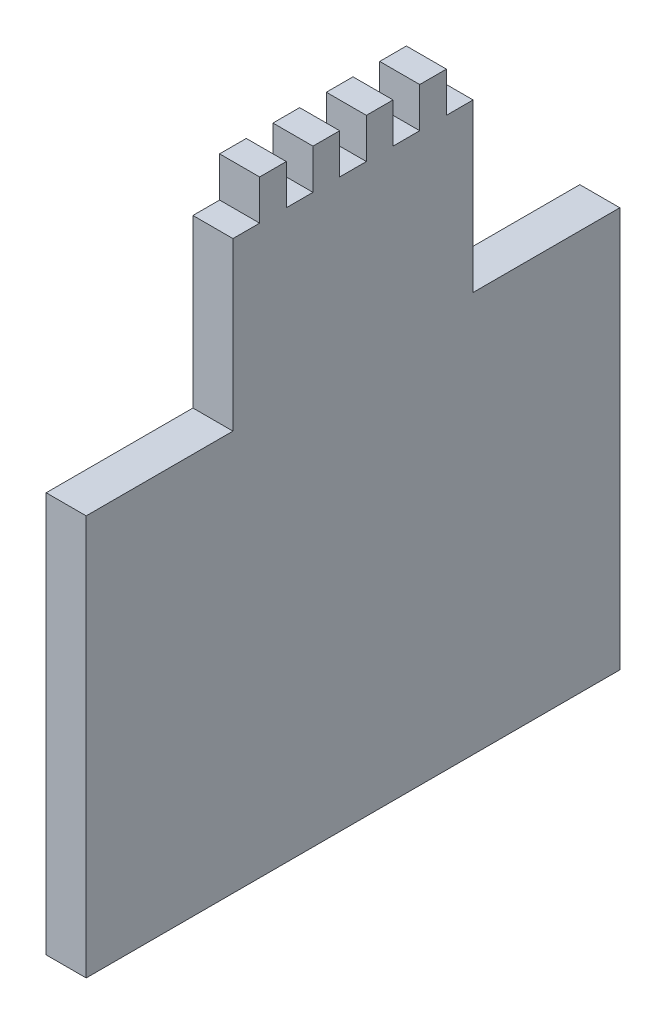
ISO-10303-21;
HEADER;
FILE_DESCRIPTION(('STEP AP214'),'2;1');
FILE_NAME('part.step','',(''),(''),'','','');
FILE_SCHEMA(('AUTOMOTIVE_DESIGN { 1 0 10303 214 1 1 1 1 }'));
ENDSEC;
DATA;
#1=APPLICATION_CONTEXT('core data for automotive mechanical design processes');
#2=APPLICATION_PROTOCOL_DEFINITION('international standard','automotive_design',2000,#1);
#3=PRODUCT_CONTEXT('',#1,'mechanical');
#4=PRODUCT('Part','Part','',(#3));
#5=PRODUCT_RELATED_PRODUCT_CATEGORY('part','',(#4));
#6=PRODUCT_DEFINITION_FORMATION('','',#4);
#7=PRODUCT_DEFINITION_CONTEXT('part definition',#1,'design');
#8=PRODUCT_DEFINITION('design','',#6,#7);
#9=PRODUCT_DEFINITION_SHAPE('','',#8);
#10=(LENGTH_UNIT() NAMED_UNIT(*) SI_UNIT(.MILLI.,.METRE.));
#11=(NAMED_UNIT(*) PLANE_ANGLE_UNIT() SI_UNIT($,.RADIAN.));
#12=(NAMED_UNIT(*) SI_UNIT($,.STERADIAN.) SOLID_ANGLE_UNIT());
#13=UNCERTAINTY_MEASURE_WITH_UNIT(LENGTH_MEASURE(1.E-05),#10,'distance_accuracy_value','');
#14=(GEOMETRIC_REPRESENTATION_CONTEXT(3) GLOBAL_UNCERTAINTY_ASSIGNED_CONTEXT((#13)) GLOBAL_UNIT_ASSIGNED_CONTEXT((#10,
#11,#12)) REPRESENTATION_CONTEXT('',''));
#15=CARTESIAN_POINT('',(0.,0.,0.));
#16=DIRECTION('',(0.,0.,1.));
#17=DIRECTION('',(1.,0.,0.));
#18=AXIS2_PLACEMENT_3D('',#15,#16,#17);
#19=CARTESIAN_POINT('',(3.,0.,9.00000000000001));
#20=DIRECTION('',(0.,-1.,0.));
#21=DIRECTION('',(0.,0.,-1.));
#22=AXIS2_PLACEMENT_3D('',#19,#20,#21);
#23=PLANE('',#22);
#24=DIRECTION('',(0.,0.,1.));
#25=VECTOR('',#24,1.);
#26=CARTESIAN_POINT('',(0.,0.,9.00000000000001));
#27=LINE('',#26,#25);
#28=CARTESIAN_POINT('',(0.,0.,9.00000000000001));
#29=VERTEX_POINT('',#28);
#30=CARTESIAN_POINT('',(0.,0.,20.));
#31=VERTEX_POINT('',#30);
#32=EDGE_CURVE('E225',#29,#31,#27,.T.);
#33=ORIENTED_EDGE('',*,*,#32,.T.);
#34=DIRECTION('',(-1.,0.,0.));
#35=VECTOR('',#34,1.);
#36=CARTESIAN_POINT('',(3.,0.,20.));
#37=LINE('',#36,#35);
#38=CARTESIAN_POINT('',(3.,0.,20.));
#39=VERTEX_POINT('',#38);
#40=EDGE_CURVE('E11',#39,#31,#37,.T.);
#41=ORIENTED_EDGE('',*,*,#40,.F.);
#42=DIRECTION('',(0.,0.,1.));
#43=VECTOR('',#42,1.);
#44=CARTESIAN_POINT('',(3.,0.,9.00000000000001));
#45=LINE('',#44,#43);
#46=CARTESIAN_POINT('',(3.,0.,9.00000000000001));
#47=VERTEX_POINT('',#46);
#48=EDGE_CURVE('E271',#47,#39,#45,.T.);
#49=ORIENTED_EDGE('',*,*,#48,.F.);
#50=DIRECTION('',(-1.,0.,0.));
#51=VECTOR('',#50,1.);
#52=CARTESIAN_POINT('',(3.,0.,9.00000000000001));
#53=LINE('',#52,#51);
#54=EDGE_CURVE('E221',#47,#29,#53,.T.);
#55=ORIENTED_EDGE('',*,*,#54,.T.);
#56=EDGE_LOOP('',(#33,#41,#49,#55));
#57=FACE_BOUND('',#56,.T.);
#58=ADVANCED_FACE('F33',(#57),#23,.F.);
#59=CARTESIAN_POINT('',(3.,0.,20.));
#60=DIRECTION('',(0.,0.,-1.));
#61=DIRECTION('',(0.,1.,0.));
#62=AXIS2_PLACEMENT_3D('',#59,#60,#61);
#63=PLANE('',#62);
#64=DIRECTION('',(0.,-1.,0.));
#65=VECTOR('',#64,1.);
#66=CARTESIAN_POINT('',(0.,0.,20.));
#67=LINE('',#66,#65);
#68=CARTESIAN_POINT('',(0.,-30.,20.));
#69=VERTEX_POINT('',#68);
#70=EDGE_CURVE('E228',#31,#69,#67,.T.);
#71=ORIENTED_EDGE('',*,*,#70,.T.);
#72=DIRECTION('',(-1.,0.,0.));
#73=VECTOR('',#72,1.);
#74=CARTESIAN_POINT('',(3.,-30.,20.));
#75=LINE('',#74,#73);
#76=CARTESIAN_POINT('',(3.,-30.,20.));
#77=VERTEX_POINT('',#76);
#78=EDGE_CURVE('E41',#77,#69,#75,.T.);
#79=ORIENTED_EDGE('',*,*,#78,.F.);
#80=DIRECTION('',(0.,-1.,0.));
#81=VECTOR('',#80,1.);
#82=CARTESIAN_POINT('',(3.,0.,20.));
#83=LINE('',#82,#81);
#84=EDGE_CURVE('E140',#39,#77,#83,.T.);
#85=ORIENTED_EDGE('',*,*,#84,.F.);
#86=ORIENTED_EDGE('',*,*,#40,.T.);
#87=EDGE_LOOP('',(#71,#79,#85,#86));
#88=FACE_BOUND('',#87,.T.);
#89=ADVANCED_FACE('F409',(#88),#63,.F.);
#90=CARTESIAN_POINT('',(3.,-30.,20.));
#91=DIRECTION('',(0.,1.,0.));
#92=DIRECTION('',(0.,0.,1.));
#93=AXIS2_PLACEMENT_3D('',#90,#91,#92);
#94=PLANE('',#93);
#95=DIRECTION('',(0.,0.,-1.));
#96=VECTOR('',#95,1.);
#97=CARTESIAN_POINT('',(0.,-30.,20.));
#98=LINE('',#97,#96);
#99=CARTESIAN_POINT('',(0.,-30.,-20.));
#100=VERTEX_POINT('',#99);
#101=EDGE_CURVE('E230',#69,#100,#98,.T.);
#102=ORIENTED_EDGE('',*,*,#101,.T.);
#103=DIRECTION('',(-1.,0.,0.));
#104=VECTOR('',#103,1.);
#105=CARTESIAN_POINT('',(3.,-30.,-20.));
#106=LINE('',#105,#104);
#107=CARTESIAN_POINT('',(3.,-30.,-20.));
#108=VERTEX_POINT('',#107);
#109=EDGE_CURVE('E326',#108,#100,#106,.T.);
#110=ORIENTED_EDGE('',*,*,#109,.F.);
#111=DIRECTION('',(0.,0.,-1.));
#112=VECTOR('',#111,1.);
#113=CARTESIAN_POINT('',(3.,-30.,20.));
#114=LINE('',#113,#112);
#115=EDGE_CURVE('E334',#77,#108,#114,.T.);
#116=ORIENTED_EDGE('',*,*,#115,.F.);
#117=ORIENTED_EDGE('',*,*,#78,.T.);
#118=EDGE_LOOP('',(#102,#110,#116,#117));
#119=FACE_BOUND('',#118,.T.);
#120=ADVANCED_FACE('F332',(#119),#94,.F.);
#121=CARTESIAN_POINT('',(3.,-30.,-20.));
#122=DIRECTION('',(0.,0.,1.));
#123=DIRECTION('',(0.,-1.,0.));
#124=AXIS2_PLACEMENT_3D('',#121,#122,#123);
#125=PLANE('',#124);
#126=DIRECTION('',(0.,1.,0.));
#127=VECTOR('',#126,1.);
#128=CARTESIAN_POINT('',(0.,-30.,-20.));
#129=LINE('',#128,#127);
#130=CARTESIAN_POINT('',(0.,0.,-20.));
#131=VERTEX_POINT('',#130);
#132=EDGE_CURVE('E232',#100,#131,#129,.T.);
#133=ORIENTED_EDGE('',*,*,#132,.T.);
#134=DIRECTION('',(-1.,0.,0.));
#135=VECTOR('',#134,1.);
#136=CARTESIAN_POINT('',(3.,0.,-20.));
#137=LINE('',#136,#135);
#138=CARTESIAN_POINT('',(3.,0.,-20.));
#139=VERTEX_POINT('',#138);
#140=EDGE_CURVE('E323',#139,#131,#137,.T.);
#141=ORIENTED_EDGE('',*,*,#140,.F.);
#142=DIRECTION('',(0.,1.,0.));
#143=VECTOR('',#142,1.);
#144=CARTESIAN_POINT('',(3.,-30.,-20.));
#145=LINE('',#144,#143);
#146=EDGE_CURVE('E352',#108,#139,#145,.T.);
#147=ORIENTED_EDGE('',*,*,#146,.F.);
#148=ORIENTED_EDGE('',*,*,#109,.T.);
#149=EDGE_LOOP('',(#133,#141,#147,#148));
#150=FACE_BOUND('',#149,.T.);
#151=ADVANCED_FACE('F343',(#150),#125,.F.);
#152=CARTESIAN_POINT('',(3.,0.,-20.));
#153=DIRECTION('',(0.,-1.,0.));
#154=DIRECTION('',(0.,0.,-1.));
#155=AXIS2_PLACEMENT_3D('',#152,#153,#154);
#156=PLANE('',#155);
#157=DIRECTION('',(0.,0.,1.));
#158=VECTOR('',#157,1.);
#159=CARTESIAN_POINT('',(0.,0.,-20.));
#160=LINE('',#159,#158);
#161=CARTESIAN_POINT('',(0.,0.,-9.00000000000001));
#162=VERTEX_POINT('',#161);
#163=EDGE_CURVE('E234',#131,#162,#160,.T.);
#164=ORIENTED_EDGE('',*,*,#163,.T.);
#165=DIRECTION('',(-1.,0.,0.));
#166=VECTOR('',#165,1.);
#167=CARTESIAN_POINT('',(3.,0.,-9.00000000000001));
#168=LINE('',#167,#166);
#169=CARTESIAN_POINT('',(3.,0.,-9.00000000000001));
#170=VERTEX_POINT('',#169);
#171=EDGE_CURVE('E320',#170,#162,#168,.T.);
#172=ORIENTED_EDGE('',*,*,#171,.F.);
#173=DIRECTION('',(0.,0.,1.));
#174=VECTOR('',#173,1.);
#175=CARTESIAN_POINT('',(3.,0.,-20.));
#176=LINE('',#175,#174);
#177=EDGE_CURVE('E349',#139,#170,#176,.T.);
#178=ORIENTED_EDGE('',*,*,#177,.F.);
#179=ORIENTED_EDGE('',*,*,#140,.T.);
#180=EDGE_LOOP('',(#164,#172,#178,#179));
#181=FACE_BOUND('',#180,.T.);
#182=ADVANCED_FACE('F347',(#181),#156,.F.);
#183=CARTESIAN_POINT('',(3.,0.,-9.00000000000001));
#184=DIRECTION('',(0.,0.,1.));
#185=DIRECTION('',(0.,-1.,0.));
#186=AXIS2_PLACEMENT_3D('',#183,#184,#185);
#187=PLANE('',#186);
#188=DIRECTION('',(0.,1.,0.));
#189=VECTOR('',#188,1.);
#190=CARTESIAN_POINT('',(0.,0.,-9.00000000000001));
#191=LINE('',#190,#189);
#192=CARTESIAN_POINT('',(0.,12.5,-9.00000000000001));
#193=VERTEX_POINT('',#192);
#194=EDGE_CURVE('E236',#162,#193,#191,.T.);
#195=ORIENTED_EDGE('',*,*,#194,.T.);
#196=DIRECTION('',(-1.,0.,0.));
#197=VECTOR('',#196,1.);
#198=CARTESIAN_POINT('',(3.,12.5,-9.00000000000001));
#199=LINE('',#198,#197);
#200=CARTESIAN_POINT('',(3.,12.5,-9.00000000000001));
#201=VERTEX_POINT('',#200);
#202=EDGE_CURVE('E317',#201,#193,#199,.T.);
#203=ORIENTED_EDGE('',*,*,#202,.F.);
#204=DIRECTION('',(0.,1.,0.));
#205=VECTOR('',#204,1.);
#206=CARTESIAN_POINT('',(3.,0.,-9.00000000000001));
#207=LINE('',#206,#205);
#208=EDGE_CURVE('E351',#170,#201,#207,.T.);
#209=ORIENTED_EDGE('',*,*,#208,.F.);
#210=ORIENTED_EDGE('',*,*,#171,.T.);
#211=EDGE_LOOP('',(#195,#203,#209,#210));
#212=FACE_BOUND('',#211,.T.);
#213=ADVANCED_FACE('F422',(#212),#187,.F.);
#214=CARTESIAN_POINT('',(3.,12.5,-7.));
#215=DIRECTION('',(0.,-1.,0.));
#216=DIRECTION('',(0.,0.,-1.));
#217=AXIS2_PLACEMENT_3D('',#214,#215,#216);
#218=PLANE('',#217);
#219=DIRECTION('',(0.,0.,1.));
#220=VECTOR('',#219,1.);
#221=CARTESIAN_POINT('',(0.,12.5,-7.));
#222=LINE('',#221,#220);
#223=CARTESIAN_POINT('',(0.,12.5,-7.));
#224=VERTEX_POINT('',#223);
#225=EDGE_CURVE('E238',#193,#224,#222,.T.);
#226=ORIENTED_EDGE('',*,*,#225,.T.);
#227=DIRECTION('',(-1.,0.,0.));
#228=VECTOR('',#227,1.);
#229=CARTESIAN_POINT('',(3.,12.5,-7.));
#230=LINE('',#229,#228);
#231=CARTESIAN_POINT('',(3.,12.5,-7.));
#232=VERTEX_POINT('',#231);
#233=EDGE_CURVE('E314',#232,#224,#230,.T.);
#234=ORIENTED_EDGE('',*,*,#233,.F.);
#235=DIRECTION('',(0.,0.,1.));
#236=VECTOR('',#235,1.);
#237=CARTESIAN_POINT('',(3.,12.5,-7.));
#238=LINE('',#237,#236);
#239=EDGE_CURVE('E354',#201,#232,#238,.T.);
#240=ORIENTED_EDGE('',*,*,#239,.F.);
#241=ORIENTED_EDGE('',*,*,#202,.T.);
#242=EDGE_LOOP('',(#226,#234,#240,#241));
#243=FACE_BOUND('',#242,.T.);
#244=ADVANCED_FACE('F425',(#243),#218,.F.);
#245=CARTESIAN_POINT('',(3.,12.5,-7.));
#246=DIRECTION('',(0.,0.,1.));
#247=DIRECTION('',(0.,-1.,0.));
#248=AXIS2_PLACEMENT_3D('',#245,#246,#247);
#249=PLANE('',#248);
#250=DIRECTION('',(0.,1.,0.));
#251=VECTOR('',#250,1.);
#252=CARTESIAN_POINT('',(0.,12.5,-7.));
#253=LINE('',#252,#251);
#254=CARTESIAN_POINT('',(0.,15.5,-7.));
#255=VERTEX_POINT('',#254);
#256=EDGE_CURVE('E240',#224,#255,#253,.T.);
#257=ORIENTED_EDGE('',*,*,#256,.T.);
#258=DIRECTION('',(-1.,0.,0.));
#259=VECTOR('',#258,1.);
#260=CARTESIAN_POINT('',(3.,15.5,-7.));
#261=LINE('',#260,#259);
#262=CARTESIAN_POINT('',(3.,15.5,-7.));
#263=VERTEX_POINT('',#262);
#264=EDGE_CURVE('E311',#263,#255,#261,.T.);
#265=ORIENTED_EDGE('',*,*,#264,.F.);
#266=DIRECTION('',(0.,1.,0.));
#267=VECTOR('',#266,1.);
#268=CARTESIAN_POINT('',(3.,12.5,-7.));
#269=LINE('',#268,#267);
#270=EDGE_CURVE('E360',#232,#263,#269,.T.);
#271=ORIENTED_EDGE('',*,*,#270,.F.);
#272=ORIENTED_EDGE('',*,*,#233,.T.);
#273=EDGE_LOOP('',(#257,#265,#271,#272));
#274=FACE_BOUND('',#273,.T.);
#275=ADVANCED_FACE('F429',(#274),#249,.F.);
#276=CARTESIAN_POINT('',(3.,15.5,-5.00000000000001));
#277=DIRECTION('',(0.,-1.,0.));
#278=DIRECTION('',(0.,0.,-1.));
#279=AXIS2_PLACEMENT_3D('',#276,#277,#278);
#280=PLANE('',#279);
#281=DIRECTION('',(0.,0.,1.));
#282=VECTOR('',#281,1.);
#283=CARTESIAN_POINT('',(0.,15.5,-5.00000000000001));
#284=LINE('',#283,#282);
#285=CARTESIAN_POINT('',(0.,15.5,-5.00000000000001));
#286=VERTEX_POINT('',#285);
#287=EDGE_CURVE('E242',#255,#286,#284,.T.);
#288=ORIENTED_EDGE('',*,*,#287,.T.);
#289=DIRECTION('',(-1.,0.,0.));
#290=VECTOR('',#289,1.);
#291=CARTESIAN_POINT('',(3.,15.5,-5.00000000000001));
#292=LINE('',#291,#290);
#293=CARTESIAN_POINT('',(3.,15.5,-5.00000000000001));
#294=VERTEX_POINT('',#293);
#295=EDGE_CURVE('E308',#294,#286,#292,.T.);
#296=ORIENTED_EDGE('',*,*,#295,.F.);
#297=DIRECTION('',(0.,0.,1.));
#298=VECTOR('',#297,1.);
#299=CARTESIAN_POINT('',(3.,15.5,-5.00000000000001));
#300=LINE('',#299,#298);
#301=EDGE_CURVE('E362',#263,#294,#300,.T.);
#302=ORIENTED_EDGE('',*,*,#301,.F.);
#303=ORIENTED_EDGE('',*,*,#264,.T.);
#304=EDGE_LOOP('',(#288,#296,#302,#303));
#305=FACE_BOUND('',#304,.T.);
#306=ADVANCED_FACE('F433',(#305),#280,.F.);
#307=CARTESIAN_POINT('',(3.,15.5,-5.00000000000001));
#308=DIRECTION('',(0.,0.,-1.));
#309=DIRECTION('',(0.,1.,0.));
#310=AXIS2_PLACEMENT_3D('',#307,#308,#309);
#311=PLANE('',#310);
#312=DIRECTION('',(0.,-1.,0.));
#313=VECTOR('',#312,1.);
#314=CARTESIAN_POINT('',(0.,15.5,-5.00000000000001));
#315=LINE('',#314,#313);
#316=CARTESIAN_POINT('',(0.,12.5,-5.00000000000001));
#317=VERTEX_POINT('',#316);
#318=EDGE_CURVE('E244',#286,#317,#315,.T.);
#319=ORIENTED_EDGE('',*,*,#318,.T.);
#320=DIRECTION('',(-1.,0.,0.));
#321=VECTOR('',#320,1.);
#322=CARTESIAN_POINT('',(3.,12.5,-5.00000000000001));
#323=LINE('',#322,#321);
#324=CARTESIAN_POINT('',(3.,12.5,-5.00000000000001));
#325=VERTEX_POINT('',#324);
#326=EDGE_CURVE('E305',#325,#317,#323,.T.);
#327=ORIENTED_EDGE('',*,*,#326,.F.);
#328=DIRECTION('',(0.,-1.,0.));
#329=VECTOR('',#328,1.);
#330=CARTESIAN_POINT('',(3.,15.5,-5.00000000000001));
#331=LINE('',#330,#329);
#332=EDGE_CURVE('E364',#294,#325,#331,.T.);
#333=ORIENTED_EDGE('',*,*,#332,.F.);
#334=ORIENTED_EDGE('',*,*,#295,.T.);
#335=EDGE_LOOP('',(#319,#327,#333,#334));
#336=FACE_BOUND('',#335,.T.);
#337=ADVANCED_FACE('F437',(#336),#311,.F.);
#338=CARTESIAN_POINT('',(3.,12.5,-3.00000000000001));
#339=DIRECTION('',(0.,-1.,0.));
#340=DIRECTION('',(0.,0.,-1.));
#341=AXIS2_PLACEMENT_3D('',#338,#339,#340);
#342=PLANE('',#341);
#343=DIRECTION('',(0.,0.,1.));
#344=VECTOR('',#343,1.);
#345=CARTESIAN_POINT('',(0.,12.5,-3.00000000000001));
#346=LINE('',#345,#344);
#347=CARTESIAN_POINT('',(0.,12.5,-3.00000000000001));
#348=VERTEX_POINT('',#347);
#349=EDGE_CURVE('E246',#317,#348,#346,.T.);
#350=ORIENTED_EDGE('',*,*,#349,.T.);
#351=DIRECTION('',(-1.,0.,0.));
#352=VECTOR('',#351,1.);
#353=CARTESIAN_POINT('',(3.,12.5,-3.00000000000001));
#354=LINE('',#353,#352);
#355=CARTESIAN_POINT('',(3.,12.5,-3.00000000000001));
#356=VERTEX_POINT('',#355);
#357=EDGE_CURVE('E302',#356,#348,#354,.T.);
#358=ORIENTED_EDGE('',*,*,#357,.F.);
#359=DIRECTION('',(0.,0.,1.));
#360=VECTOR('',#359,1.);
#361=CARTESIAN_POINT('',(3.,12.5,-3.00000000000001));
#362=LINE('',#361,#360);
#363=EDGE_CURVE('E366',#325,#356,#362,.T.);
#364=ORIENTED_EDGE('',*,*,#363,.F.);
#365=ORIENTED_EDGE('',*,*,#326,.T.);
#366=EDGE_LOOP('',(#350,#358,#364,#365));
#367=FACE_BOUND('',#366,.T.);
#368=ADVANCED_FACE('F441',(#367),#342,.F.);
#369=CARTESIAN_POINT('',(3.,12.5,-3.00000000000001));
#370=DIRECTION('',(0.,0.,1.));
#371=DIRECTION('',(0.,-1.,0.));
#372=AXIS2_PLACEMENT_3D('',#369,#370,#371);
#373=PLANE('',#372);
#374=DIRECTION('',(0.,1.,0.));
#375=VECTOR('',#374,1.);
#376=CARTESIAN_POINT('',(0.,12.5,-3.00000000000001));
#377=LINE('',#376,#375);
#378=CARTESIAN_POINT('',(0.,15.5,-3.00000000000001));
#379=VERTEX_POINT('',#378);
#380=EDGE_CURVE('E248',#348,#379,#377,.T.);
#381=ORIENTED_EDGE('',*,*,#380,.T.);
#382=DIRECTION('',(-1.,0.,0.));
#383=VECTOR('',#382,1.);
#384=CARTESIAN_POINT('',(3.,15.5,-3.00000000000001));
#385=LINE('',#384,#383);
#386=CARTESIAN_POINT('',(3.,15.5,-3.00000000000001));
#387=VERTEX_POINT('',#386);
#388=EDGE_CURVE('E299',#387,#379,#385,.T.);
#389=ORIENTED_EDGE('',*,*,#388,.F.);
#390=DIRECTION('',(0.,1.,0.));
#391=VECTOR('',#390,1.);
#392=CARTESIAN_POINT('',(3.,12.5,-3.00000000000001));
#393=LINE('',#392,#391);
#394=EDGE_CURVE('E368',#356,#387,#393,.T.);
#395=ORIENTED_EDGE('',*,*,#394,.F.);
#396=ORIENTED_EDGE('',*,*,#357,.T.);
#397=EDGE_LOOP('',(#381,#389,#395,#396));
#398=FACE_BOUND('',#397,.T.);
#399=ADVANCED_FACE('F445',(#398),#373,.F.);
#400=CARTESIAN_POINT('',(3.,15.5,-0.999999999999996));
#401=DIRECTION('',(0.,-1.,0.));
#402=DIRECTION('',(0.,0.,-1.));
#403=AXIS2_PLACEMENT_3D('',#400,#401,#402);
#404=PLANE('',#403);
#405=DIRECTION('',(0.,0.,1.));
#406=VECTOR('',#405,1.);
#407=CARTESIAN_POINT('',(0.,15.5,-0.999999999999996));
#408=LINE('',#407,#406);
#409=CARTESIAN_POINT('',(0.,15.5,-0.999999999999996));
#410=VERTEX_POINT('',#409);
#411=EDGE_CURVE('E250',#379,#410,#408,.T.);
#412=ORIENTED_EDGE('',*,*,#411,.T.);
#413=DIRECTION('',(-1.,0.,0.));
#414=VECTOR('',#413,1.);
#415=CARTESIAN_POINT('',(3.,15.5,-0.999999999999996));
#416=LINE('',#415,#414);
#417=CARTESIAN_POINT('',(3.,15.5,-0.999999999999996));
#418=VERTEX_POINT('',#417);
#419=EDGE_CURVE('E296',#418,#410,#416,.T.);
#420=ORIENTED_EDGE('',*,*,#419,.F.);
#421=DIRECTION('',(0.,0.,1.));
#422=VECTOR('',#421,1.);
#423=CARTESIAN_POINT('',(3.,15.5,-0.999999999999996));
#424=LINE('',#423,#422);
#425=EDGE_CURVE('E370',#387,#418,#424,.T.);
#426=ORIENTED_EDGE('',*,*,#425,.F.);
#427=ORIENTED_EDGE('',*,*,#388,.T.);
#428=EDGE_LOOP('',(#412,#420,#426,#427));
#429=FACE_BOUND('',#428,.T.);
#430=ADVANCED_FACE('F449',(#429),#404,.F.);
#431=CARTESIAN_POINT('',(3.,15.5,-0.999999999999996));
#432=DIRECTION('',(0.,0.,-1.));
#433=DIRECTION('',(0.,1.,0.));
#434=AXIS2_PLACEMENT_3D('',#431,#432,#433);
#435=PLANE('',#434);
#436=DIRECTION('',(0.,-1.,0.));
#437=VECTOR('',#436,1.);
#438=CARTESIAN_POINT('',(0.,15.5,-0.999999999999996));
#439=LINE('',#438,#437);
#440=CARTESIAN_POINT('',(0.,12.5,-1.00000000000001));
#441=VERTEX_POINT('',#440);
#442=EDGE_CURVE('E252',#410,#441,#439,.T.);
#443=ORIENTED_EDGE('',*,*,#442,.T.);
#444=DIRECTION('',(-1.,0.,0.));
#445=VECTOR('',#444,1.);
#446=CARTESIAN_POINT('',(3.,12.5,-1.00000000000001));
#447=LINE('',#446,#445);
#448=CARTESIAN_POINT('',(3.,12.5,-1.00000000000001));
#449=VERTEX_POINT('',#448);
#450=EDGE_CURVE('E293',#449,#441,#447,.T.);
#451=ORIENTED_EDGE('',*,*,#450,.F.);
#452=DIRECTION('',(0.,-1.,0.));
#453=VECTOR('',#452,1.);
#454=CARTESIAN_POINT('',(3.,15.5,-0.999999999999996));
#455=LINE('',#454,#453);
#456=EDGE_CURVE('E372',#418,#449,#455,.T.);
#457=ORIENTED_EDGE('',*,*,#456,.F.);
#458=ORIENTED_EDGE('',*,*,#419,.T.);
#459=EDGE_LOOP('',(#443,#451,#457,#458));
#460=FACE_BOUND('',#459,.T.);
#461=ADVANCED_FACE('F453',(#460),#435,.F.);
#462=CARTESIAN_POINT('',(3.,12.5,1.00000000000001));
#463=DIRECTION('',(0.,-1.,0.));
#464=DIRECTION('',(0.,0.,-1.));
#465=AXIS2_PLACEMENT_3D('',#462,#463,#464);
#466=PLANE('',#465);
#467=DIRECTION('',(0.,0.,1.));
#468=VECTOR('',#467,1.);
#469=CARTESIAN_POINT('',(0.,12.5,1.00000000000001));
#470=LINE('',#469,#468);
#471=CARTESIAN_POINT('',(0.,12.5,1.00000000000001));
#472=VERTEX_POINT('',#471);
#473=EDGE_CURVE('E254',#441,#472,#470,.T.);
#474=ORIENTED_EDGE('',*,*,#473,.T.);
#475=DIRECTION('',(-1.,0.,0.));
#476=VECTOR('',#475,1.);
#477=CARTESIAN_POINT('',(3.,12.5,1.00000000000001));
#478=LINE('',#477,#476);
#479=CARTESIAN_POINT('',(3.,12.5,1.00000000000001));
#480=VERTEX_POINT('',#479);
#481=EDGE_CURVE('E290',#480,#472,#478,.T.);
#482=ORIENTED_EDGE('',*,*,#481,.F.);
#483=DIRECTION('',(0.,0.,1.));
#484=VECTOR('',#483,1.);
#485=CARTESIAN_POINT('',(3.,12.5,1.00000000000001));
#486=LINE('',#485,#484);
#487=EDGE_CURVE('E374',#449,#480,#486,.T.);
#488=ORIENTED_EDGE('',*,*,#487,.F.);
#489=ORIENTED_EDGE('',*,*,#450,.T.);
#490=EDGE_LOOP('',(#474,#482,#488,#489));
#491=FACE_BOUND('',#490,.T.);
#492=ADVANCED_FACE('F457',(#491),#466,.F.);
#493=CARTESIAN_POINT('',(3.,12.5,1.00000000000001));
#494=DIRECTION('',(0.,0.,1.));
#495=DIRECTION('',(0.,-1.,0.));
#496=AXIS2_PLACEMENT_3D('',#493,#494,#495);
#497=PLANE('',#496);
#498=DIRECTION('',(0.,1.,0.));
#499=VECTOR('',#498,1.);
#500=CARTESIAN_POINT('',(0.,12.5,1.00000000000001));
#501=LINE('',#500,#499);
#502=CARTESIAN_POINT('',(0.,15.5,1.00000000000001));
#503=VERTEX_POINT('',#502);
#504=EDGE_CURVE('E256',#472,#503,#501,.T.);
#505=ORIENTED_EDGE('',*,*,#504,.T.);
#506=DIRECTION('',(-1.,0.,0.));
#507=VECTOR('',#506,1.);
#508=CARTESIAN_POINT('',(3.,15.5,1.00000000000001));
#509=LINE('',#508,#507);
#510=CARTESIAN_POINT('',(3.,15.5,1.00000000000001));
#511=VERTEX_POINT('',#510);
#512=EDGE_CURVE('E287',#511,#503,#509,.T.);
#513=ORIENTED_EDGE('',*,*,#512,.F.);
#514=DIRECTION('',(0.,1.,0.));
#515=VECTOR('',#514,1.);
#516=CARTESIAN_POINT('',(3.,12.5,1.00000000000001));
#517=LINE('',#516,#515);
#518=EDGE_CURVE('E376',#480,#511,#517,.T.);
#519=ORIENTED_EDGE('',*,*,#518,.F.);
#520=ORIENTED_EDGE('',*,*,#481,.T.);
#521=EDGE_LOOP('',(#505,#513,#519,#520));
#522=FACE_BOUND('',#521,.T.);
#523=ADVANCED_FACE('F461',(#522),#497,.F.);
#524=CARTESIAN_POINT('',(3.,15.5,3.00000000000001));
#525=DIRECTION('',(0.,-1.,0.));
#526=DIRECTION('',(0.,0.,-1.));
#527=AXIS2_PLACEMENT_3D('',#524,#525,#526);
#528=PLANE('',#527);
#529=DIRECTION('',(0.,0.,1.));
#530=VECTOR('',#529,1.);
#531=CARTESIAN_POINT('',(0.,15.5,3.00000000000001));
#532=LINE('',#531,#530);
#533=CARTESIAN_POINT('',(0.,15.5,3.00000000000001));
#534=VERTEX_POINT('',#533);
#535=EDGE_CURVE('E258',#503,#534,#532,.T.);
#536=ORIENTED_EDGE('',*,*,#535,.T.);
#537=DIRECTION('',(-1.,0.,0.));
#538=VECTOR('',#537,1.);
#539=CARTESIAN_POINT('',(3.,15.5,3.00000000000001));
#540=LINE('',#539,#538);
#541=CARTESIAN_POINT('',(3.,15.5,3.00000000000001));
#542=VERTEX_POINT('',#541);
#543=EDGE_CURVE('E284',#542,#534,#540,.T.);
#544=ORIENTED_EDGE('',*,*,#543,.F.);
#545=DIRECTION('',(0.,0.,1.));
#546=VECTOR('',#545,1.);
#547=CARTESIAN_POINT('',(3.,15.5,3.00000000000001));
#548=LINE('',#547,#546);
#549=EDGE_CURVE('E378',#511,#542,#548,.T.);
#550=ORIENTED_EDGE('',*,*,#549,.F.);
#551=ORIENTED_EDGE('',*,*,#512,.T.);
#552=EDGE_LOOP('',(#536,#544,#550,#551));
#553=FACE_BOUND('',#552,.T.);
#554=ADVANCED_FACE('F465',(#553),#528,.F.);
#555=CARTESIAN_POINT('',(3.,15.5,3.00000000000001));
#556=DIRECTION('',(0.,0.,-1.));
#557=DIRECTION('',(0.,1.,0.));
#558=AXIS2_PLACEMENT_3D('',#555,#556,#557);
#559=PLANE('',#558);
#560=DIRECTION('',(0.,-1.,0.));
#561=VECTOR('',#560,1.);
#562=CARTESIAN_POINT('',(0.,15.5,3.00000000000001));
#563=LINE('',#562,#561);
#564=CARTESIAN_POINT('',(0.,12.5,3.00000000000001));
#565=VERTEX_POINT('',#564);
#566=EDGE_CURVE('E260',#534,#565,#563,.T.);
#567=ORIENTED_EDGE('',*,*,#566,.T.);
#568=DIRECTION('',(-1.,0.,0.));
#569=VECTOR('',#568,1.);
#570=CARTESIAN_POINT('',(3.,12.5,3.00000000000001));
#571=LINE('',#570,#569);
#572=CARTESIAN_POINT('',(3.,12.5,3.00000000000001));
#573=VERTEX_POINT('',#572);
#574=EDGE_CURVE('E281',#573,#565,#571,.T.);
#575=ORIENTED_EDGE('',*,*,#574,.F.);
#576=DIRECTION('',(0.,-1.,0.));
#577=VECTOR('',#576,1.);
#578=CARTESIAN_POINT('',(3.,15.5,3.00000000000001));
#579=LINE('',#578,#577);
#580=EDGE_CURVE('E380',#542,#573,#579,.T.);
#581=ORIENTED_EDGE('',*,*,#580,.F.);
#582=ORIENTED_EDGE('',*,*,#543,.T.);
#583=EDGE_LOOP('',(#567,#575,#581,#582));
#584=FACE_BOUND('',#583,.T.);
#585=ADVANCED_FACE('F469',(#584),#559,.F.);
#586=CARTESIAN_POINT('',(3.,12.5,5.00000000000001));
#587=DIRECTION('',(0.,-1.,0.));
#588=DIRECTION('',(0.,0.,-1.));
#589=AXIS2_PLACEMENT_3D('',#586,#587,#588);
#590=PLANE('',#589);
#591=DIRECTION('',(0.,0.,1.));
#592=VECTOR('',#591,1.);
#593=CARTESIAN_POINT('',(0.,12.5,5.00000000000001));
#594=LINE('',#593,#592);
#595=CARTESIAN_POINT('',(0.,12.5,5.00000000000001));
#596=VERTEX_POINT('',#595);
#597=EDGE_CURVE('E262',#565,#596,#594,.T.);
#598=ORIENTED_EDGE('',*,*,#597,.T.);
#599=DIRECTION('',(-1.,0.,0.));
#600=VECTOR('',#599,1.);
#601=CARTESIAN_POINT('',(3.,12.5,5.00000000000001));
#602=LINE('',#601,#600);
#603=CARTESIAN_POINT('',(3.,12.5,5.00000000000001));
#604=VERTEX_POINT('',#603);
#605=EDGE_CURVE('E278',#604,#596,#602,.T.);
#606=ORIENTED_EDGE('',*,*,#605,.F.);
#607=DIRECTION('',(0.,0.,1.));
#608=VECTOR('',#607,1.);
#609=CARTESIAN_POINT('',(3.,12.5,5.00000000000001));
#610=LINE('',#609,#608);
#611=EDGE_CURVE('E382',#573,#604,#610,.T.);
#612=ORIENTED_EDGE('',*,*,#611,.F.);
#613=ORIENTED_EDGE('',*,*,#574,.T.);
#614=EDGE_LOOP('',(#598,#606,#612,#613));
#615=FACE_BOUND('',#614,.T.);
#616=ADVANCED_FACE('F473',(#615),#590,.F.);
#617=CARTESIAN_POINT('',(3.,12.5,5.00000000000001));
#618=DIRECTION('',(0.,0.,1.));
#619=DIRECTION('',(0.,-1.,0.));
#620=AXIS2_PLACEMENT_3D('',#617,#618,#619);
#621=PLANE('',#620);
#622=DIRECTION('',(0.,1.,0.));
#623=VECTOR('',#622,1.);
#624=CARTESIAN_POINT('',(0.,12.5,5.00000000000001));
#625=LINE('',#624,#623);
#626=CARTESIAN_POINT('',(0.,15.5,5.00000000000001));
#627=VERTEX_POINT('',#626);
#628=EDGE_CURVE('E264',#596,#627,#625,.T.);
#629=ORIENTED_EDGE('',*,*,#628,.T.);
#630=DIRECTION('',(-1.,0.,0.));
#631=VECTOR('',#630,1.);
#632=CARTESIAN_POINT('',(3.,15.5,5.00000000000001));
#633=LINE('',#632,#631);
#634=CARTESIAN_POINT('',(3.,15.5,5.00000000000001));
#635=VERTEX_POINT('',#634);
#636=EDGE_CURVE('E275',#635,#627,#633,.T.);
#637=ORIENTED_EDGE('',*,*,#636,.F.);
#638=DIRECTION('',(0.,1.,0.));
#639=VECTOR('',#638,1.);
#640=CARTESIAN_POINT('',(3.,12.5,5.00000000000001));
#641=LINE('',#640,#639);
#642=EDGE_CURVE('E384',#604,#635,#641,.T.);
#643=ORIENTED_EDGE('',*,*,#642,.F.);
#644=ORIENTED_EDGE('',*,*,#605,.T.);
#645=EDGE_LOOP('',(#629,#637,#643,#644));
#646=FACE_BOUND('',#645,.T.);
#647=ADVANCED_FACE('F390',(#646),#621,.F.);
#648=CARTESIAN_POINT('',(3.,15.5,7.00000000000001));
#649=DIRECTION('',(0.,-1.,0.));
#650=DIRECTION('',(0.,0.,-1.));
#651=AXIS2_PLACEMENT_3D('',#648,#649,#650);
#652=PLANE('',#651);
#653=DIRECTION('',(0.,0.,1.));
#654=VECTOR('',#653,1.);
#655=CARTESIAN_POINT('',(0.,15.5,7.00000000000001));
#656=LINE('',#655,#654);
#657=CARTESIAN_POINT('',(0.,15.5,7.00000000000001));
#658=VERTEX_POINT('',#657);
#659=EDGE_CURVE('E266',#627,#658,#656,.T.);
#660=ORIENTED_EDGE('',*,*,#659,.T.);
#661=DIRECTION('',(-1.,0.,0.));
#662=VECTOR('',#661,1.);
#663=CARTESIAN_POINT('',(3.,15.5,7.00000000000001));
#664=LINE('',#663,#662);
#665=CARTESIAN_POINT('',(3.,15.5,7.00000000000001));
#666=VERTEX_POINT('',#665);
#667=EDGE_CURVE('E216',#666,#658,#664,.T.);
#668=ORIENTED_EDGE('',*,*,#667,.F.);
#669=DIRECTION('',(0.,0.,1.));
#670=VECTOR('',#669,1.);
#671=CARTESIAN_POINT('',(3.,15.5,7.00000000000001));
#672=LINE('',#671,#670);
#673=EDGE_CURVE('E207',#635,#666,#672,.T.);
#674=ORIENTED_EDGE('',*,*,#673,.F.);
#675=ORIENTED_EDGE('',*,*,#636,.T.);
#676=EDGE_LOOP('',(#660,#668,#674,#675));
#677=FACE_BOUND('',#676,.T.);
#678=ADVANCED_FACE('F394',(#677),#652,.F.);
#679=CARTESIAN_POINT('',(3.,15.5,7.00000000000001));
#680=DIRECTION('',(0.,0.,-1.));
#681=DIRECTION('',(0.,1.,0.));
#682=AXIS2_PLACEMENT_3D('',#679,#680,#681);
#683=PLANE('',#682);
#684=DIRECTION('',(0.,-1.,0.));
#685=VECTOR('',#684,1.);
#686=CARTESIAN_POINT('',(0.,15.5,7.00000000000001));
#687=LINE('',#686,#685);
#688=CARTESIAN_POINT('',(0.,12.5,7.00000000000001));
#689=VERTEX_POINT('',#688);
#690=EDGE_CURVE('E215',#658,#689,#687,.T.);
#691=ORIENTED_EDGE('',*,*,#690,.T.);
#692=DIRECTION('',(-1.,0.,0.));
#693=VECTOR('',#692,1.);
#694=CARTESIAN_POINT('',(3.,12.5,7.00000000000001));
#695=LINE('',#694,#693);
#696=CARTESIAN_POINT('',(3.,12.5,7.00000000000001));
#697=VERTEX_POINT('',#696);
#698=EDGE_CURVE('E212',#697,#689,#695,.T.);
#699=ORIENTED_EDGE('',*,*,#698,.F.);
#700=DIRECTION('',(0.,-1.,0.));
#701=VECTOR('',#700,1.);
#702=CARTESIAN_POINT('',(3.,15.5,7.00000000000001));
#703=LINE('',#702,#701);
#704=EDGE_CURVE('E201',#666,#697,#703,.T.);
#705=ORIENTED_EDGE('',*,*,#704,.F.);
#706=ORIENTED_EDGE('',*,*,#667,.T.);
#707=EDGE_LOOP('',(#691,#699,#705,#706));
#708=FACE_BOUND('',#707,.T.);
#709=ADVANCED_FACE('F213',(#708),#683,.F.);
#710=CARTESIAN_POINT('',(3.,12.5,7.00000000000001));
#711=DIRECTION('',(0.,-1.,0.));
#712=DIRECTION('',(0.,0.,-1.));
#713=AXIS2_PLACEMENT_3D('',#710,#711,#712);
#714=PLANE('',#713);
#715=DIRECTION('',(0.,0.,1.));
#716=VECTOR('',#715,1.);
#717=CARTESIAN_POINT('',(0.,12.5,7.00000000000001));
#718=LINE('',#717,#716);
#719=CARTESIAN_POINT('',(0.,12.5,9.00000000000001));
#720=VERTEX_POINT('',#719);
#721=EDGE_CURVE('E126',#689,#720,#718,.T.);
#722=ORIENTED_EDGE('',*,*,#721,.T.);
#723=DIRECTION('',(-1.,0.,0.));
#724=VECTOR('',#723,1.);
#725=CARTESIAN_POINT('',(3.,12.5,9.00000000000001));
#726=LINE('',#725,#724);
#727=CARTESIAN_POINT('',(3.,12.5,9.00000000000001));
#728=VERTEX_POINT('',#727);
#729=EDGE_CURVE('E217',#728,#720,#726,.T.);
#730=ORIENTED_EDGE('',*,*,#729,.F.);
#731=DIRECTION('',(0.,0.,1.));
#732=VECTOR('',#731,1.);
#733=CARTESIAN_POINT('',(3.,12.5,7.00000000000001));
#734=LINE('',#733,#732);
#735=EDGE_CURVE('E205',#697,#728,#734,.T.);
#736=ORIENTED_EDGE('',*,*,#735,.F.);
#737=ORIENTED_EDGE('',*,*,#698,.T.);
#738=EDGE_LOOP('',(#722,#730,#736,#737));
#739=FACE_BOUND('',#738,.T.);
#740=ADVANCED_FACE('F219',(#739),#714,.F.);
#741=CARTESIAN_POINT('',(3.,12.5,9.00000000000001));
#742=DIRECTION('',(0.,0.,-1.));
#743=DIRECTION('',(0.,1.,0.));
#744=AXIS2_PLACEMENT_3D('',#741,#742,#743);
#745=PLANE('',#744);
#746=DIRECTION('',(0.,-1.,0.));
#747=VECTOR('',#746,1.);
#748=CARTESIAN_POINT('',(0.,12.5,9.00000000000001));
#749=LINE('',#748,#747);
#750=EDGE_CURVE('E132',#720,#29,#749,.T.);
#751=ORIENTED_EDGE('',*,*,#750,.T.);
#752=ORIENTED_EDGE('',*,*,#54,.F.);
#753=DIRECTION('',(0.,-1.,0.));
#754=VECTOR('',#753,1.);
#755=CARTESIAN_POINT('',(3.,12.5,9.00000000000001));
#756=LINE('',#755,#754);
#757=EDGE_CURVE('E49',#728,#47,#756,.T.);
#758=ORIENTED_EDGE('',*,*,#757,.F.);
#759=ORIENTED_EDGE('',*,*,#729,.T.);
#760=EDGE_LOOP('',(#751,#752,#758,#759));
#761=FACE_BOUND('',#760,.T.);
#762=ADVANCED_FACE('F398',(#761),#745,.F.);
#763=CARTESIAN_POINT('',(3.,0.,0.));
#764=DIRECTION('',(1.,0.,0.));
#765=DIRECTION('',(0.,0.,-1.));
#766=AXIS2_PLACEMENT_3D('',#763,#764,#765);
#767=PLANE('',#766);
#768=ORIENTED_EDGE('',*,*,#48,.T.);
#769=ORIENTED_EDGE('',*,*,#84,.T.);
#770=ORIENTED_EDGE('',*,*,#115,.T.);
#771=ORIENTED_EDGE('',*,*,#146,.T.);
#772=ORIENTED_EDGE('',*,*,#177,.T.);
#773=ORIENTED_EDGE('',*,*,#208,.T.);
#774=ORIENTED_EDGE('',*,*,#239,.T.);
#775=ORIENTED_EDGE('',*,*,#270,.T.);
#776=ORIENTED_EDGE('',*,*,#301,.T.);
#777=ORIENTED_EDGE('',*,*,#332,.T.);
#778=ORIENTED_EDGE('',*,*,#363,.T.);
#779=ORIENTED_EDGE('',*,*,#394,.T.);
#780=ORIENTED_EDGE('',*,*,#425,.T.);
#781=ORIENTED_EDGE('',*,*,#456,.T.);
#782=ORIENTED_EDGE('',*,*,#487,.T.);
#783=ORIENTED_EDGE('',*,*,#518,.T.);
#784=ORIENTED_EDGE('',*,*,#549,.T.);
#785=ORIENTED_EDGE('',*,*,#580,.T.);
#786=ORIENTED_EDGE('',*,*,#611,.T.);
#787=ORIENTED_EDGE('',*,*,#642,.T.);
#788=ORIENTED_EDGE('',*,*,#673,.T.);
#789=ORIENTED_EDGE('',*,*,#704,.T.);
#790=ORIENTED_EDGE('',*,*,#735,.T.);
#791=ORIENTED_EDGE('',*,*,#757,.T.);
#792=EDGE_LOOP('',(#768,#769,#770,#771,#772,#773,#774,#775,#776,#777,#778,#779,#780,#781,#782,
#783,#784,#785,#786,#787,#788,#789,#790,#791));
#793=FACE_BOUND('',#792,.T.);
#794=ADVANCED_FACE('F203',(#793),#767,.T.);
#795=CARTESIAN_POINT('',(0.,0.,0.));
#796=DIRECTION('',(1.,0.,0.));
#797=DIRECTION('',(0.,0.,-1.));
#798=AXIS2_PLACEMENT_3D('',#795,#796,#797);
#799=PLANE('',#798);
#800=ORIENTED_EDGE('',*,*,#32,.F.);
#801=ORIENTED_EDGE('',*,*,#750,.F.);
#802=ORIENTED_EDGE('',*,*,#721,.F.);
#803=ORIENTED_EDGE('',*,*,#690,.F.);
#804=ORIENTED_EDGE('',*,*,#659,.F.);
#805=ORIENTED_EDGE('',*,*,#628,.F.);
#806=ORIENTED_EDGE('',*,*,#597,.F.);
#807=ORIENTED_EDGE('',*,*,#566,.F.);
#808=ORIENTED_EDGE('',*,*,#535,.F.);
#809=ORIENTED_EDGE('',*,*,#504,.F.);
#810=ORIENTED_EDGE('',*,*,#473,.F.);
#811=ORIENTED_EDGE('',*,*,#442,.F.);
#812=ORIENTED_EDGE('',*,*,#411,.F.);
#813=ORIENTED_EDGE('',*,*,#380,.F.);
#814=ORIENTED_EDGE('',*,*,#349,.F.);
#815=ORIENTED_EDGE('',*,*,#318,.F.);
#816=ORIENTED_EDGE('',*,*,#287,.F.);
#817=ORIENTED_EDGE('',*,*,#256,.F.);
#818=ORIENTED_EDGE('',*,*,#225,.F.);
#819=ORIENTED_EDGE('',*,*,#194,.F.);
#820=ORIENTED_EDGE('',*,*,#163,.F.);
#821=ORIENTED_EDGE('',*,*,#132,.F.);
#822=ORIENTED_EDGE('',*,*,#101,.F.);
#823=ORIENTED_EDGE('',*,*,#70,.F.);
#824=EDGE_LOOP('',(#800,#801,#802,#803,#804,#805,#806,#807,#808,#809,#810,#811,#812,#813,#814,
#815,#816,#817,#818,#819,#820,#821,#822,#823));
#825=FACE_BOUND('',#824,.T.);
#826=ADVANCED_FACE('F338',(#825),#799,.F.);
#827=CLOSED_SHELL('',(#58,#89,#120,#151,#182,#213,#244,#275,#306,#337,#368,#399,#430,#461,#492,
#523,#554,#585,#616,#647,#678,#709,#740,#762,#794,#826));
#828=MANIFOLD_SOLID_BREP('B2',#827);
#829=ADVANCED_BREP_SHAPE_REPRESENTATION('',(#18,#828),#14);
#830=SHAPE_DEFINITION_REPRESENTATION(#9,#829);
ENDSEC;
END-ISO-10303-21;
